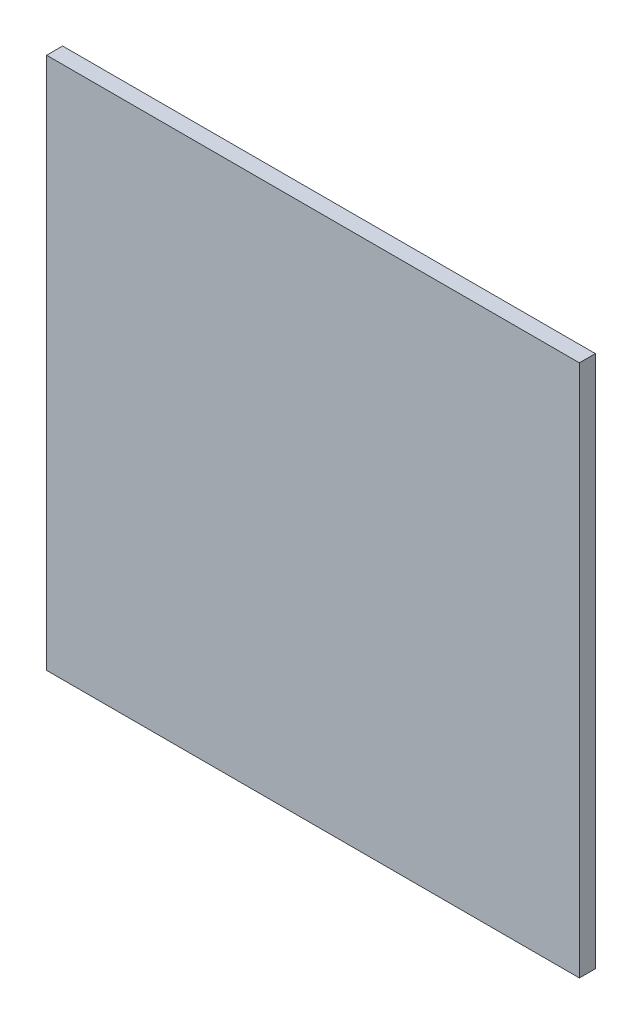
ISO-10303-21;
HEADER;
FILE_DESCRIPTION(('STEP AP214'),'2;1');
FILE_NAME('part.step','',(''),(''),'','','');
FILE_SCHEMA(('AUTOMOTIVE_DESIGN { 1 0 10303 214 1 1 1 1 }'));
ENDSEC;
DATA;
#1=APPLICATION_CONTEXT('core data for automotive mechanical design processes');
#2=APPLICATION_PROTOCOL_DEFINITION('international standard','automotive_design',2000,#1);
#3=PRODUCT_CONTEXT('',#1,'mechanical');
#4=PRODUCT('Part','Part','',(#3));
#5=PRODUCT_RELATED_PRODUCT_CATEGORY('part','',(#4));
#6=PRODUCT_DEFINITION_FORMATION('','',#4);
#7=PRODUCT_DEFINITION_CONTEXT('part definition',#1,'design');
#8=PRODUCT_DEFINITION('design','',#6,#7);
#9=PRODUCT_DEFINITION_SHAPE('','',#8);
#10=(LENGTH_UNIT() NAMED_UNIT(*) SI_UNIT(.MILLI.,.METRE.));
#11=(NAMED_UNIT(*) PLANE_ANGLE_UNIT() SI_UNIT($,.RADIAN.));
#12=(NAMED_UNIT(*) SI_UNIT($,.STERADIAN.) SOLID_ANGLE_UNIT());
#13=UNCERTAINTY_MEASURE_WITH_UNIT(LENGTH_MEASURE(1.E-05),#10,'distance_accuracy_value','');
#14=(GEOMETRIC_REPRESENTATION_CONTEXT(3) GLOBAL_UNCERTAINTY_ASSIGNED_CONTEXT((#13)) GLOBAL_UNIT_ASSIGNED_CONTEXT((#10,
#11,#12)) REPRESENTATION_CONTEXT('',''));
#15=CARTESIAN_POINT('',(0.,0.,0.));
#16=DIRECTION('',(0.,0.,1.));
#17=DIRECTION('',(1.,0.,0.));
#18=AXIS2_PLACEMENT_3D('',#15,#16,#17);
#19=CARTESIAN_POINT('',(-50.,50.,3.));
#20=DIRECTION('',(0.,-1.,0.));
#21=DIRECTION('',(1.,0.,0.));
#22=AXIS2_PLACEMENT_3D('',#19,#20,#21);
#23=PLANE('',#22);
#24=DIRECTION('',(-1.,0.,0.));
#25=VECTOR('',#24,1.);
#26=CARTESIAN_POINT('',(-50.,50.,0.));
#27=LINE('',#26,#25);
#28=CARTESIAN_POINT('',(50.,50.,0.));
#29=VERTEX_POINT('',#28);
#30=CARTESIAN_POINT('',(-50.,50.,0.));
#31=VERTEX_POINT('',#30);
#32=EDGE_CURVE('E105',#29,#31,#27,.T.);
#33=ORIENTED_EDGE('',*,*,#32,.T.);
#34=DIRECTION('',(0.,0.,-1.));
#35=VECTOR('',#34,1.);
#36=CARTESIAN_POINT('',(-50.,50.,3.));
#37=LINE('',#36,#35);
#38=CARTESIAN_POINT('',(-50.,50.,3.));
#39=VERTEX_POINT('',#38);
#40=EDGE_CURVE('E11',#39,#31,#37,.T.);
#41=ORIENTED_EDGE('',*,*,#40,.F.);
#42=DIRECTION('',(-1.,0.,0.));
#43=VECTOR('',#42,1.);
#44=CARTESIAN_POINT('',(-50.,50.,3.));
#45=LINE('',#44,#43);
#46=CARTESIAN_POINT('',(50.,50.,3.));
#47=VERTEX_POINT('',#46);
#48=EDGE_CURVE('E89',#47,#39,#45,.T.);
#49=ORIENTED_EDGE('',*,*,#48,.F.);
#50=DIRECTION('',(0.,0.,-1.));
#51=VECTOR('',#50,1.);
#52=CARTESIAN_POINT('',(50.,50.,3.));
#53=LINE('',#52,#51);
#54=EDGE_CURVE('E97',#47,#29,#53,.T.);
#55=ORIENTED_EDGE('',*,*,#54,.T.);
#56=EDGE_LOOP('',(#33,#41,#49,#55));
#57=FACE_BOUND('',#56,.T.);
#58=ADVANCED_FACE('F39',(#57),#23,.F.);
#59=CARTESIAN_POINT('',(-50.,-50.,3.));
#60=DIRECTION('',(1.,0.,0.));
#61=DIRECTION('',(0.,0.,-1.));
#62=AXIS2_PLACEMENT_3D('',#59,#60,#61);
#63=PLANE('',#62);
#64=DIRECTION('',(0.,-1.,0.));
#65=VECTOR('',#64,1.);
#66=CARTESIAN_POINT('',(-50.,-50.,0.));
#67=LINE('',#66,#65);
#68=CARTESIAN_POINT('',(-50.,-50.,0.));
#69=VERTEX_POINT('',#68);
#70=EDGE_CURVE('E92',#31,#69,#67,.T.);
#71=ORIENTED_EDGE('',*,*,#70,.T.);
#72=DIRECTION('',(0.,0.,-1.));
#73=VECTOR('',#72,1.);
#74=CARTESIAN_POINT('',(-50.,-50.,3.));
#75=LINE('',#74,#73);
#76=CARTESIAN_POINT('',(-50.,-50.,3.));
#77=VERTEX_POINT('',#76);
#78=EDGE_CURVE('E50',#77,#69,#75,.T.);
#79=ORIENTED_EDGE('',*,*,#78,.F.);
#80=DIRECTION('',(0.,-1.,0.));
#81=VECTOR('',#80,1.);
#82=CARTESIAN_POINT('',(-50.,-50.,3.));
#83=LINE('',#82,#81);
#84=EDGE_CURVE('E82',#39,#77,#83,.T.);
#85=ORIENTED_EDGE('',*,*,#84,.F.);
#86=ORIENTED_EDGE('',*,*,#40,.T.);
#87=EDGE_LOOP('',(#71,#79,#85,#86));
#88=FACE_BOUND('',#87,.T.);
#89=ADVANCED_FACE('F93',(#88),#63,.F.);
#90=CARTESIAN_POINT('',(-50.,-50.,3.));
#91=DIRECTION('',(0.,1.,0.));
#92=DIRECTION('',(-1.,0.,0.));
#93=AXIS2_PLACEMENT_3D('',#90,#91,#92);
#94=PLANE('',#93);
#95=DIRECTION('',(1.,0.,0.));
#96=VECTOR('',#95,1.);
#97=CARTESIAN_POINT('',(-50.,-50.,0.));
#98=LINE('',#97,#96);
#99=CARTESIAN_POINT('',(50.,-50.,0.));
#100=VERTEX_POINT('',#99);
#101=EDGE_CURVE('E72',#69,#100,#98,.T.);
#102=ORIENTED_EDGE('',*,*,#101,.T.);
#103=DIRECTION('',(0.,0.,-1.));
#104=VECTOR('',#103,1.);
#105=CARTESIAN_POINT('',(50.,-50.,3.));
#106=LINE('',#105,#104);
#107=CARTESIAN_POINT('',(50.,-50.,3.));
#108=VERTEX_POINT('',#107);
#109=EDGE_CURVE('E94',#108,#100,#106,.T.);
#110=ORIENTED_EDGE('',*,*,#109,.F.);
#111=DIRECTION('',(1.,0.,0.));
#112=VECTOR('',#111,1.);
#113=CARTESIAN_POINT('',(-50.,-50.,3.));
#114=LINE('',#113,#112);
#115=EDGE_CURVE('E88',#77,#108,#114,.T.);
#116=ORIENTED_EDGE('',*,*,#115,.F.);
#117=ORIENTED_EDGE('',*,*,#78,.T.);
#118=EDGE_LOOP('',(#102,#110,#116,#117));
#119=FACE_BOUND('',#118,.T.);
#120=ADVANCED_FACE('F96',(#119),#94,.F.);
#121=CARTESIAN_POINT('',(50.,-50.,3.));
#122=DIRECTION('',(-1.,0.,0.));
#123=DIRECTION('',(0.,0.,1.));
#124=AXIS2_PLACEMENT_3D('',#121,#122,#123);
#125=PLANE('',#124);
#126=DIRECTION('',(0.,1.,0.));
#127=VECTOR('',#126,1.);
#128=CARTESIAN_POINT('',(50.,-50.,0.));
#129=LINE('',#128,#127);
#130=EDGE_CURVE('E76',#100,#29,#129,.T.);
#131=ORIENTED_EDGE('',*,*,#130,.T.);
#132=ORIENTED_EDGE('',*,*,#54,.F.);
#133=DIRECTION('',(0.,1.,0.));
#134=VECTOR('',#133,1.);
#135=CARTESIAN_POINT('',(50.,-50.,3.));
#136=LINE('',#135,#134);
#137=EDGE_CURVE('E54',#108,#47,#136,.T.);
#138=ORIENTED_EDGE('',*,*,#137,.F.);
#139=ORIENTED_EDGE('',*,*,#109,.T.);
#140=EDGE_LOOP('',(#131,#132,#138,#139));
#141=FACE_BOUND('',#140,.T.);
#142=ADVANCED_FACE('F108',(#141),#125,.F.);
#143=CARTESIAN_POINT('',(0.,0.,3.));
#144=DIRECTION('',(0.,0.,1.));
#145=DIRECTION('',(1.,0.,0.));
#146=AXIS2_PLACEMENT_3D('',#143,#144,#145);
#147=PLANE('',#146);
#148=ORIENTED_EDGE('',*,*,#48,.T.);
#149=ORIENTED_EDGE('',*,*,#84,.T.);
#150=ORIENTED_EDGE('',*,*,#115,.T.);
#151=ORIENTED_EDGE('',*,*,#137,.T.);
#152=EDGE_LOOP('',(#148,#149,#150,#151));
#153=FACE_BOUND('',#152,.T.);
#154=ADVANCED_FACE('F86',(#153),#147,.T.);
#155=CARTESIAN_POINT('',(0.,0.,0.));
#156=DIRECTION('',(0.,0.,1.));
#157=DIRECTION('',(1.,0.,0.));
#158=AXIS2_PLACEMENT_3D('',#155,#156,#157);
#159=PLANE('',#158);
#160=ORIENTED_EDGE('',*,*,#32,.F.);
#161=ORIENTED_EDGE('',*,*,#130,.F.);
#162=ORIENTED_EDGE('',*,*,#101,.F.);
#163=ORIENTED_EDGE('',*,*,#70,.F.);
#164=EDGE_LOOP('',(#160,#161,#162,#163));
#165=FACE_BOUND('',#164,.T.);
#166=ADVANCED_FACE('F115',(#165),#159,.F.);
#167=CLOSED_SHELL('',(#58,#89,#120,#142,#154,#166));
#168=MANIFOLD_SOLID_BREP('B2',#167);
#169=ADVANCED_BREP_SHAPE_REPRESENTATION('',(#18,#168),#14);
#170=SHAPE_DEFINITION_REPRESENTATION(#9,#169);
ENDSEC;
END-ISO-10303-21;
